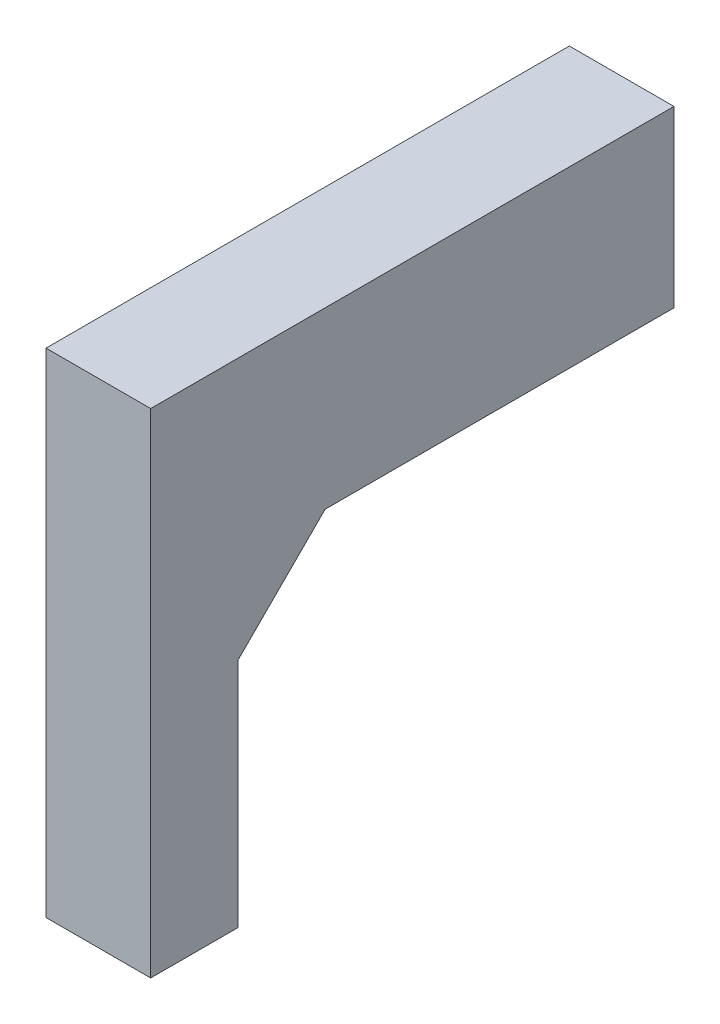
ISO-10303-21;
HEADER;
FILE_DESCRIPTION(('STEP AP214'),'2;1');
FILE_NAME('part.step','',(''),(''),'','','');
FILE_SCHEMA(('AUTOMOTIVE_DESIGN { 1 0 10303 214 1 1 1 1 }'));
ENDSEC;
DATA;
#1=APPLICATION_CONTEXT('core data for automotive mechanical design processes');
#2=APPLICATION_PROTOCOL_DEFINITION('international standard','automotive_design',2000,#1);
#3=PRODUCT_CONTEXT('',#1,'mechanical');
#4=PRODUCT('Part','Part','',(#3));
#5=PRODUCT_RELATED_PRODUCT_CATEGORY('part','',(#4));
#6=PRODUCT_DEFINITION_FORMATION('','',#4);
#7=PRODUCT_DEFINITION_CONTEXT('part definition',#1,'design');
#8=PRODUCT_DEFINITION('design','',#6,#7);
#9=PRODUCT_DEFINITION_SHAPE('','',#8);
#10=(LENGTH_UNIT() NAMED_UNIT(*) SI_UNIT(.MILLI.,.METRE.));
#11=(NAMED_UNIT(*) PLANE_ANGLE_UNIT() SI_UNIT($,.RADIAN.));
#12=(NAMED_UNIT(*) SI_UNIT($,.STERADIAN.) SOLID_ANGLE_UNIT());
#13=UNCERTAINTY_MEASURE_WITH_UNIT(LENGTH_MEASURE(1.E-05),#10,'distance_accuracy_value','');
#14=(GEOMETRIC_REPRESENTATION_CONTEXT(3) GLOBAL_UNCERTAINTY_ASSIGNED_CONTEXT((#13)) GLOBAL_UNIT_ASSIGNED_CONTEXT((#10,
#11,#12)) REPRESENTATION_CONTEXT('',''));
#15=CARTESIAN_POINT('',(0.,0.,0.));
#16=DIRECTION('',(0.,0.,1.));
#17=DIRECTION('',(1.,0.,0.));
#18=AXIS2_PLACEMENT_3D('',#15,#16,#17);
#19=CARTESIAN_POINT('',(30.,-50.,100.));
#20=DIRECTION('',(0.,-0.707106781186547,-0.707106781186547));
#21=DIRECTION('',(0.,0.707106781186548,-0.707106781186548));
#22=AXIS2_PLACEMENT_3D('',#19,#20,#21);
#23=PLANE('',#22);
#24=DIRECTION('',(0.,-0.707106781186547,0.707106781186547));
#25=VECTOR('',#24,1.);
#26=CARTESIAN_POINT('',(0.,-50.,100.));
#27=LINE('',#26,#25);
#28=CARTESIAN_POINT('',(0.,-50.,100.));
#29=VERTEX_POINT('',#28);
#30=CARTESIAN_POINT('',(0.,-74.9608693758851,124.960869375885));
#31=VERTEX_POINT('',#30);
#32=EDGE_CURVE('E139',#29,#31,#27,.T.);
#33=ORIENTED_EDGE('',*,*,#32,.F.);
#34=DIRECTION('',(-1.,0.,0.));
#35=VECTOR('',#34,1.);
#36=CARTESIAN_POINT('',(30.,-50.,100.));
#37=LINE('',#36,#35);
#38=CARTESIAN_POINT('',(30.,-50.,100.));
#39=VERTEX_POINT('',#38);
#40=EDGE_CURVE('E11',#39,#29,#37,.T.);
#41=ORIENTED_EDGE('',*,*,#40,.F.);
#42=DIRECTION('',(0.,-0.707106781186547,0.707106781186547));
#43=VECTOR('',#42,1.);
#44=CARTESIAN_POINT('',(30.,-50.,100.));
#45=LINE('',#44,#43);
#46=CARTESIAN_POINT('',(30.,-74.9608693758851,124.960869375885));
#47=VERTEX_POINT('',#46);
#48=EDGE_CURVE('E163',#39,#47,#45,.T.);
#49=ORIENTED_EDGE('',*,*,#48,.T.);
#50=DIRECTION('',(-1.,0.,0.));
#51=VECTOR('',#50,1.);
#52=CARTESIAN_POINT('',(30.,-74.9608693758851,124.960869375885));
#53=LINE('',#52,#51);
#54=EDGE_CURVE('E48',#47,#31,#53,.T.);
#55=ORIENTED_EDGE('',*,*,#54,.T.);
#56=EDGE_LOOP('',(#33,#41,#49,#55));
#57=FACE_BOUND('',#56,.T.);
#58=ADVANCED_FACE('F45',(#57),#23,.T.);
#59=CARTESIAN_POINT('',(30.,-50.,0.));
#60=DIRECTION('',(0.,-1.,0.));
#61=DIRECTION('',(0.,0.,-1.));
#62=AXIS2_PLACEMENT_3D('',#59,#60,#61);
#63=PLANE('',#62);
#64=DIRECTION('',(0.,0.,1.));
#65=VECTOR('',#64,1.);
#66=CARTESIAN_POINT('',(0.,-50.,0.));
#67=LINE('',#66,#65);
#68=CARTESIAN_POINT('',(0.,-50.,0.));
#69=VERTEX_POINT('',#68);
#70=EDGE_CURVE('E160',#69,#29,#67,.T.);
#71=ORIENTED_EDGE('',*,*,#70,.F.);
#72=DIRECTION('',(-1.,0.,0.));
#73=VECTOR('',#72,1.);
#74=CARTESIAN_POINT('',(30.,-50.,0.));
#75=LINE('',#74,#73);
#76=CARTESIAN_POINT('',(30.,-50.,0.));
#77=VERTEX_POINT('',#76);
#78=EDGE_CURVE('E55',#77,#69,#75,.T.);
#79=ORIENTED_EDGE('',*,*,#78,.F.);
#80=DIRECTION('',(0.,0.,1.));
#81=VECTOR('',#80,1.);
#82=CARTESIAN_POINT('',(30.,-50.,0.));
#83=LINE('',#82,#81);
#84=EDGE_CURVE('E132',#77,#39,#83,.T.);
#85=ORIENTED_EDGE('',*,*,#84,.T.);
#86=ORIENTED_EDGE('',*,*,#40,.T.);
#87=EDGE_LOOP('',(#71,#79,#85,#86));
#88=FACE_BOUND('',#87,.T.);
#89=ADVANCED_FACE('F178',(#88),#63,.T.);
#90=CARTESIAN_POINT('',(30.,0.,0.));
#91=DIRECTION('',(0.,0.,-1.));
#92=DIRECTION('',(-1.,0.,0.));
#93=AXIS2_PLACEMENT_3D('',#90,#91,#92);
#94=PLANE('',#93);
#95=DIRECTION('',(0.,-1.,0.));
#96=VECTOR('',#95,1.);
#97=CARTESIAN_POINT('',(0.,0.,0.));
#98=LINE('',#97,#96);
#99=CARTESIAN_POINT('',(0.,0.,0.));
#100=VERTEX_POINT('',#99);
#101=EDGE_CURVE('E115',#100,#69,#98,.T.);
#102=ORIENTED_EDGE('',*,*,#101,.F.);
#103=DIRECTION('',(-1.,0.,0.));
#104=VECTOR('',#103,1.);
#105=CARTESIAN_POINT('',(30.,0.,0.));
#106=LINE('',#105,#104);
#107=CARTESIAN_POINT('',(30.,0.,0.));
#108=VERTEX_POINT('',#107);
#109=EDGE_CURVE('E109',#108,#100,#106,.T.);
#110=ORIENTED_EDGE('',*,*,#109,.F.);
#111=DIRECTION('',(0.,-1.,0.));
#112=VECTOR('',#111,1.);
#113=CARTESIAN_POINT('',(30.,0.,0.));
#114=LINE('',#113,#112);
#115=EDGE_CURVE('E113',#108,#77,#114,.T.);
#116=ORIENTED_EDGE('',*,*,#115,.T.);
#117=ORIENTED_EDGE('',*,*,#78,.T.);
#118=EDGE_LOOP('',(#102,#110,#116,#117));
#119=FACE_BOUND('',#118,.T.);
#120=ADVANCED_FACE('F111',(#119),#94,.T.);
#121=CARTESIAN_POINT('',(30.,0.,0.));
#122=DIRECTION('',(0.,-1.,0.));
#123=DIRECTION('',(0.,0.,-1.));
#124=AXIS2_PLACEMENT_3D('',#121,#122,#123);
#125=PLANE('',#124);
#126=DIRECTION('',(0.,0.,1.));
#127=VECTOR('',#126,1.);
#128=CARTESIAN_POINT('',(0.,0.,0.));
#129=LINE('',#128,#127);
#130=CARTESIAN_POINT('',(0.,0.,150.));
#131=VERTEX_POINT('',#130);
#132=EDGE_CURVE('E155',#100,#131,#129,.T.);
#133=ORIENTED_EDGE('',*,*,#132,.T.);
#134=DIRECTION('',(-1.,0.,0.));
#135=VECTOR('',#134,1.);
#136=CARTESIAN_POINT('',(30.,0.,150.));
#137=LINE('',#136,#135);
#138=CARTESIAN_POINT('',(30.,0.,150.));
#139=VERTEX_POINT('',#138);
#140=EDGE_CURVE('E120',#139,#131,#137,.T.);
#141=ORIENTED_EDGE('',*,*,#140,.F.);
#142=DIRECTION('',(0.,0.,1.));
#143=VECTOR('',#142,1.);
#144=CARTESIAN_POINT('',(30.,0.,0.));
#145=LINE('',#144,#143);
#146=EDGE_CURVE('E123',#108,#139,#145,.T.);
#147=ORIENTED_EDGE('',*,*,#146,.F.);
#148=ORIENTED_EDGE('',*,*,#109,.T.);
#149=EDGE_LOOP('',(#133,#141,#147,#148));
#150=FACE_BOUND('',#149,.T.);
#151=ADVANCED_FACE('F124',(#150),#125,.F.);
#152=CARTESIAN_POINT('',(30.,-141.360869375885,150.));
#153=DIRECTION('',(0.,0.,1.));
#154=DIRECTION('',(1.,0.,0.));
#155=AXIS2_PLACEMENT_3D('',#152,#153,#154);
#156=PLANE('',#155);
#157=DIRECTION('',(0.,1.,0.));
#158=VECTOR('',#157,1.);
#159=CARTESIAN_POINT('',(0.,-141.360869375885,150.));
#160=LINE('',#159,#158);
#161=CARTESIAN_POINT('',(0.,-141.360869375885,150.));
#162=VERTEX_POINT('',#161);
#163=EDGE_CURVE('E151',#162,#131,#160,.T.);
#164=ORIENTED_EDGE('',*,*,#163,.F.);
#165=DIRECTION('',(-1.,0.,0.));
#166=VECTOR('',#165,1.);
#167=CARTESIAN_POINT('',(30.,-141.360869375885,150.));
#168=LINE('',#167,#166);
#169=CARTESIAN_POINT('',(30.,-141.360869375885,150.));
#170=VERTEX_POINT('',#169);
#171=EDGE_CURVE('E169',#170,#162,#168,.T.);
#172=ORIENTED_EDGE('',*,*,#171,.F.);
#173=DIRECTION('',(0.,1.,0.));
#174=VECTOR('',#173,1.);
#175=CARTESIAN_POINT('',(30.,-141.360869375885,150.));
#176=LINE('',#175,#174);
#177=EDGE_CURVE('E129',#170,#139,#176,.T.);
#178=ORIENTED_EDGE('',*,*,#177,.T.);
#179=ORIENTED_EDGE('',*,*,#140,.T.);
#180=EDGE_LOOP('',(#164,#172,#178,#179));
#181=FACE_BOUND('',#180,.T.);
#182=ADVANCED_FACE('F191',(#181),#156,.T.);
#183=CARTESIAN_POINT('',(30.,-141.360869375885,124.960869375885));
#184=DIRECTION('',(0.,-1.,0.));
#185=DIRECTION('',(0.,0.,-1.));
#186=AXIS2_PLACEMENT_3D('',#183,#184,#185);
#187=PLANE('',#186);
#188=DIRECTION('',(0.,0.,1.));
#189=VECTOR('',#188,1.);
#190=CARTESIAN_POINT('',(0.,-141.360869375885,124.960869375885));
#191=LINE('',#190,#189);
#192=CARTESIAN_POINT('',(0.,-141.360869375885,124.960869375885));
#193=VERTEX_POINT('',#192);
#194=EDGE_CURVE('E147',#193,#162,#191,.T.);
#195=ORIENTED_EDGE('',*,*,#194,.F.);
#196=DIRECTION('',(-1.,0.,0.));
#197=VECTOR('',#196,1.);
#198=CARTESIAN_POINT('',(30.,-141.360869375885,124.960869375885));
#199=LINE('',#198,#197);
#200=CARTESIAN_POINT('',(30.,-141.360869375885,124.960869375885));
#201=VERTEX_POINT('',#200);
#202=EDGE_CURVE('E171',#201,#193,#199,.T.);
#203=ORIENTED_EDGE('',*,*,#202,.F.);
#204=DIRECTION('',(0.,0.,1.));
#205=VECTOR('',#204,1.);
#206=CARTESIAN_POINT('',(30.,-141.360869375885,124.960869375885));
#207=LINE('',#206,#205);
#208=EDGE_CURVE('E257',#201,#170,#207,.T.);
#209=ORIENTED_EDGE('',*,*,#208,.T.);
#210=ORIENTED_EDGE('',*,*,#171,.T.);
#211=EDGE_LOOP('',(#195,#203,#209,#210));
#212=FACE_BOUND('',#211,.T.);
#213=ADVANCED_FACE('F194',(#212),#187,.T.);
#214=CARTESIAN_POINT('',(30.,-74.9608693758851,124.960869375885));
#215=DIRECTION('',(0.,0.,-1.));
#216=DIRECTION('',(0.,1.,0.));
#217=AXIS2_PLACEMENT_3D('',#214,#215,#216);
#218=PLANE('',#217);
#219=DIRECTION('',(0.,-1.,0.));
#220=VECTOR('',#219,1.);
#221=CARTESIAN_POINT('',(0.,-74.9608693758851,124.960869375885));
#222=LINE('',#221,#220);
#223=EDGE_CURVE('E143',#31,#193,#222,.T.);
#224=ORIENTED_EDGE('',*,*,#223,.F.);
#225=ORIENTED_EDGE('',*,*,#54,.F.);
#226=DIRECTION('',(0.,-1.,0.));
#227=VECTOR('',#226,1.);
#228=CARTESIAN_POINT('',(30.,-74.9608693758851,124.960869375885));
#229=LINE('',#228,#227);
#230=EDGE_CURVE('E259',#47,#201,#229,.T.);
#231=ORIENTED_EDGE('',*,*,#230,.T.);
#232=ORIENTED_EDGE('',*,*,#202,.T.);
#233=EDGE_LOOP('',(#224,#225,#231,#232));
#234=FACE_BOUND('',#233,.T.);
#235=ADVANCED_FACE('F175',(#234),#218,.T.);
#236=CARTESIAN_POINT('',(30.,0.,0.));
#237=DIRECTION('',(1.,0.,0.));
#238=DIRECTION('',(0.,0.,-1.));
#239=AXIS2_PLACEMENT_3D('',#236,#237,#238);
#240=PLANE('',#239);
#241=ORIENTED_EDGE('',*,*,#48,.F.);
#242=ORIENTED_EDGE('',*,*,#84,.F.);
#243=ORIENTED_EDGE('',*,*,#115,.F.);
#244=ORIENTED_EDGE('',*,*,#146,.T.);
#245=ORIENTED_EDGE('',*,*,#177,.F.);
#246=ORIENTED_EDGE('',*,*,#208,.F.);
#247=ORIENTED_EDGE('',*,*,#230,.F.);
#248=EDGE_LOOP('',(#241,#242,#243,#244,#245,#246,#247));
#249=FACE_BOUND('',#248,.T.);
#250=ADVANCED_FACE('F131',(#249),#240,.T.);
#251=CARTESIAN_POINT('',(0.,0.,0.));
#252=DIRECTION('',(1.,0.,0.));
#253=DIRECTION('',(0.,0.,-1.));
#254=AXIS2_PLACEMENT_3D('',#251,#252,#253);
#255=PLANE('',#254);
#256=ORIENTED_EDGE('',*,*,#32,.T.);
#257=ORIENTED_EDGE('',*,*,#223,.T.);
#258=ORIENTED_EDGE('',*,*,#194,.T.);
#259=ORIENTED_EDGE('',*,*,#163,.T.);
#260=ORIENTED_EDGE('',*,*,#132,.F.);
#261=ORIENTED_EDGE('',*,*,#101,.T.);
#262=ORIENTED_EDGE('',*,*,#70,.T.);
#263=EDGE_LOOP('',(#256,#257,#258,#259,#260,#261,#262));
#264=FACE_BOUND('',#263,.T.);
#265=ADVANCED_FACE('F177',(#264),#255,.F.);
#266=CLOSED_SHELL('',(#58,#89,#120,#151,#182,#213,#235,#250,#265));
#267=MANIFOLD_SOLID_BREP('B2',#266);
#268=ADVANCED_BREP_SHAPE_REPRESENTATION('',(#18,#267),#14);
#269=SHAPE_DEFINITION_REPRESENTATION(#9,#268);
ENDSEC;
END-ISO-10303-21;
